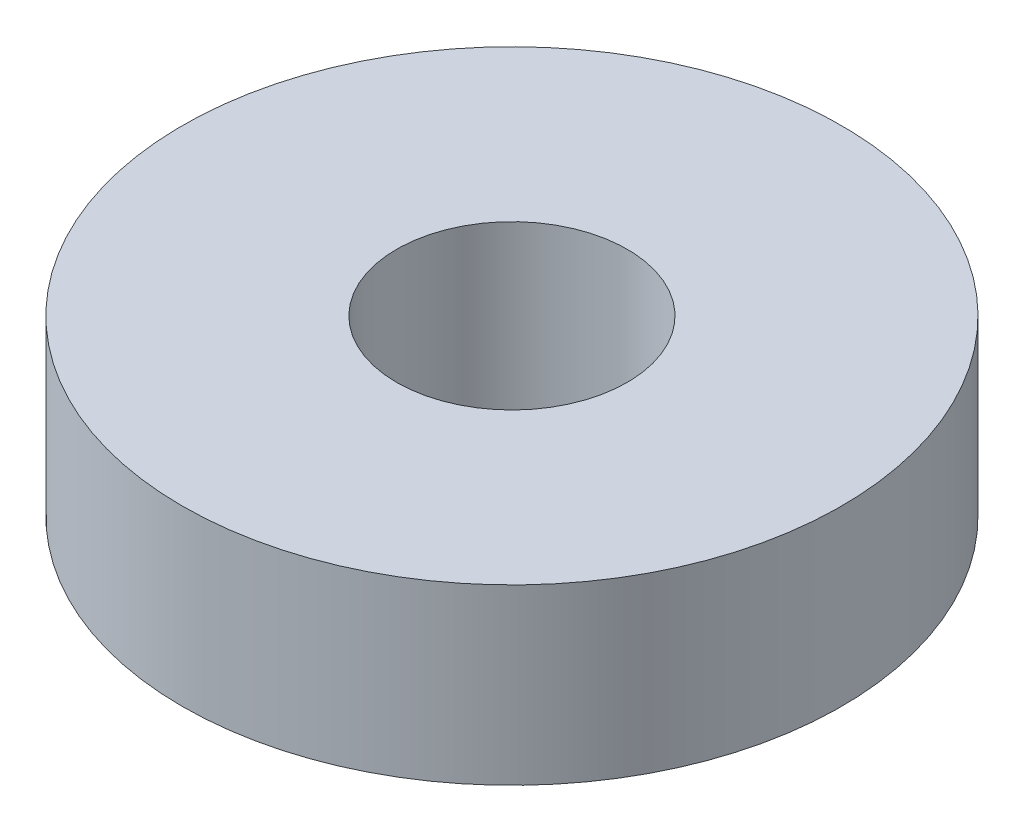
ISO-10303-21;
HEADER;
FILE_DESCRIPTION(('STEP AP214'),'2;1');
FILE_NAME('part.step','',(''),(''),'','','');
FILE_SCHEMA(('AUTOMOTIVE_DESIGN { 1 0 10303 214 1 1 1 1 }'));
ENDSEC;
DATA;
#1=APPLICATION_CONTEXT('core data for automotive mechanical design processes');
#2=APPLICATION_PROTOCOL_DEFINITION('international standard','automotive_design',2000,#1);
#3=PRODUCT_CONTEXT('',#1,'mechanical');
#4=PRODUCT('Part','Part','',(#3));
#5=PRODUCT_RELATED_PRODUCT_CATEGORY('part','',(#4));
#6=PRODUCT_DEFINITION_FORMATION('','',#4);
#7=PRODUCT_DEFINITION_CONTEXT('part definition',#1,'design');
#8=PRODUCT_DEFINITION('design','',#6,#7);
#9=PRODUCT_DEFINITION_SHAPE('','',#8);
#10=(LENGTH_UNIT() NAMED_UNIT(*) SI_UNIT(.MILLI.,.METRE.));
#11=(NAMED_UNIT(*) PLANE_ANGLE_UNIT() SI_UNIT($,.RADIAN.));
#12=(NAMED_UNIT(*) SI_UNIT($,.STERADIAN.) SOLID_ANGLE_UNIT());
#13=UNCERTAINTY_MEASURE_WITH_UNIT(LENGTH_MEASURE(1.E-05),#10,'distance_accuracy_value','');
#14=(GEOMETRIC_REPRESENTATION_CONTEXT(3) GLOBAL_UNCERTAINTY_ASSIGNED_CONTEXT((#13)) GLOBAL_UNIT_ASSIGNED_CONTEXT((#10,
#11,#12)) REPRESENTATION_CONTEXT('',''));
#15=CARTESIAN_POINT('',(0.,0.,0.));
#16=DIRECTION('',(0.,0.,1.));
#17=DIRECTION('',(1.,0.,0.));
#18=AXIS2_PLACEMENT_3D('',#15,#16,#17);
#19=CARTESIAN_POINT('',(0.,4.0132,0.));
#20=DIRECTION('',(0.,-1.,0.));
#21=DIRECTION('',(0.,0.,-1.));
#22=AXIS2_PLACEMENT_3D('',#19,#20,#21);
#23=CYLINDRICAL_SURFACE('',#22,7.62);
#24=CARTESIAN_POINT('',(0.,4.0132,0.));
#25=DIRECTION('',(0.,1.,0.));
#26=DIRECTION('',(0.,0.,1.));
#27=AXIS2_PLACEMENT_3D('',#24,#25,#26);
#28=CIRCLE('',#27,7.62);
#29=CARTESIAN_POINT('',(0.,4.0132,7.62));
#30=VERTEX_POINT('',#29);
#31=EDGE_CURVE('E10',#30,#30,#28,.T.);
#32=ORIENTED_EDGE('',*,*,#31,.F.);
#33=EDGE_LOOP('',(#32));
#34=FACE_BOUND('',#33,.T.);
#35=CARTESIAN_POINT('',(0.,0.,0.));
#36=DIRECTION('',(0.,1.,0.));
#37=DIRECTION('',(0.,0.,1.));
#38=AXIS2_PLACEMENT_3D('',#35,#36,#37);
#39=CIRCLE('',#38,7.62);
#40=CARTESIAN_POINT('',(0.,0.,7.62));
#41=VERTEX_POINT('',#40);
#42=EDGE_CURVE('E47',#41,#41,#39,.T.);
#43=ORIENTED_EDGE('',*,*,#42,.T.);
#44=EDGE_LOOP('',(#43));
#45=FACE_BOUND('',#44,.T.);
#46=ADVANCED_FACE('F44',(#34,#45),#23,.T.);
#47=CARTESIAN_POINT('',(0.,4.0132,0.));
#48=DIRECTION('',(0.,1.,0.));
#49=DIRECTION('',(0.,0.,1.));
#50=AXIS2_PLACEMENT_3D('',#47,#48,#49);
#51=PLANE('',#50);
#52=CARTESIAN_POINT('',(0.,4.0132,0.));
#53=DIRECTION('',(0.,1.,0.));
#54=DIRECTION('',(0.,0.,1.));
#55=AXIS2_PLACEMENT_3D('',#52,#53,#54);
#56=CIRCLE('',#55,2.667);
#57=CARTESIAN_POINT('',(0.,4.0132,2.667));
#58=VERTEX_POINT('',#57);
#59=EDGE_CURVE('E59',#58,#58,#56,.T.);
#60=ORIENTED_EDGE('',*,*,#59,.F.);
#61=EDGE_LOOP('',(#60));
#62=FACE_BOUND('',#61,.T.);
#63=ORIENTED_EDGE('',*,*,#31,.T.);
#64=EDGE_LOOP('',(#63));
#65=FACE_BOUND('',#64,.T.);
#66=ADVANCED_FACE('F77',(#62,#65),#51,.T.);
#67=CARTESIAN_POINT('',(0.,0.,0.));
#68=DIRECTION('',(0.,1.,0.));
#69=DIRECTION('',(0.,0.,1.));
#70=AXIS2_PLACEMENT_3D('',#67,#68,#69);
#71=PLANE('',#70);
#72=CARTESIAN_POINT('',(0.,0.,0.));
#73=DIRECTION('',(0.,1.,0.));
#74=DIRECTION('',(0.,0.,1.));
#75=AXIS2_PLACEMENT_3D('',#72,#73,#74);
#76=CIRCLE('',#75,2.667);
#77=CARTESIAN_POINT('',(0.,0.,2.667));
#78=VERTEX_POINT('',#77);
#79=EDGE_CURVE('E57',#78,#78,#76,.T.);
#80=ORIENTED_EDGE('',*,*,#79,.T.);
#81=EDGE_LOOP('',(#80));
#82=FACE_BOUND('',#81,.T.);
#83=ORIENTED_EDGE('',*,*,#42,.F.);
#84=EDGE_LOOP('',(#83));
#85=FACE_BOUND('',#84,.T.);
#86=ADVANCED_FACE('F68',(#82,#85),#71,.F.);
#87=CARTESIAN_POINT('',(0.,0.,0.));
#88=DIRECTION('',(0.,1.,0.));
#89=DIRECTION('',(0.,0.,1.));
#90=AXIS2_PLACEMENT_3D('',#87,#88,#89);
#91=CYLINDRICAL_SURFACE('',#90,2.667);
#92=ORIENTED_EDGE('',*,*,#79,.F.);
#93=EDGE_LOOP('',(#92));
#94=FACE_BOUND('',#93,.T.);
#95=ORIENTED_EDGE('',*,*,#59,.T.);
#96=EDGE_LOOP('',(#95));
#97=FACE_BOUND('',#96,.T.);
#98=ADVANCED_FACE('F71',(#94,#97),#91,.F.);
#99=CLOSED_SHELL('',(#46,#66,#86,#98));
#100=MANIFOLD_SOLID_BREP('B2',#99);
#101=ADVANCED_BREP_SHAPE_REPRESENTATION('',(#18,#100),#14);
#102=SHAPE_DEFINITION_REPRESENTATION(#9,#101);
ENDSEC;
END-ISO-10303-21;
